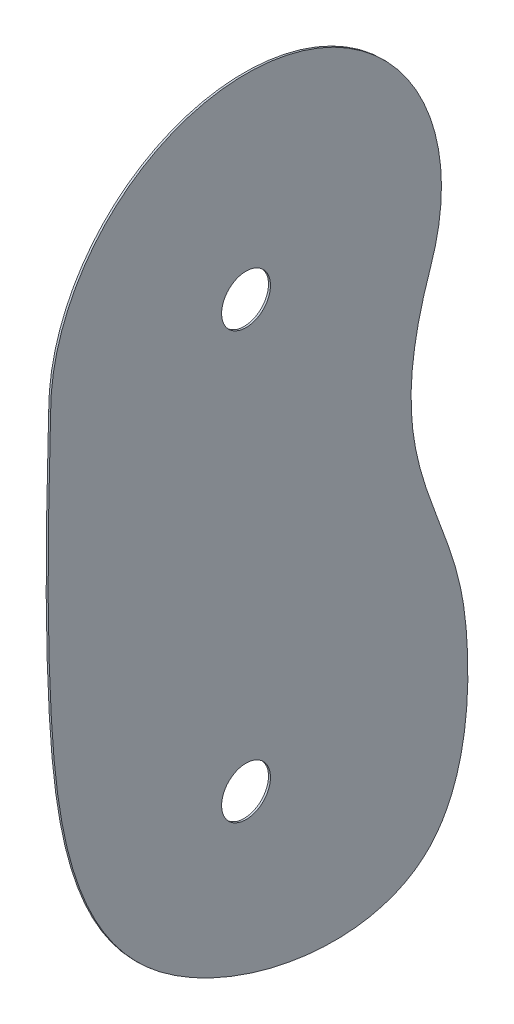
ISO-10303-21;
HEADER;
FILE_DESCRIPTION(('STEP AP214'),'2;1');
FILE_NAME('part.step','',(''),(''),'','','');
FILE_SCHEMA(('AUTOMOTIVE_DESIGN { 1 0 10303 214 1 1 1 1 }'));
ENDSEC;
DATA;
#1=APPLICATION_CONTEXT('core data for automotive mechanical design processes');
#2=APPLICATION_PROTOCOL_DEFINITION('international standard','automotive_design',2000,#1);
#3=PRODUCT_CONTEXT('',#1,'mechanical');
#4=PRODUCT('Part','Part','',(#3));
#5=PRODUCT_RELATED_PRODUCT_CATEGORY('part','',(#4));
#6=PRODUCT_DEFINITION_FORMATION('','',#4);
#7=PRODUCT_DEFINITION_CONTEXT('part definition',#1,'design');
#8=PRODUCT_DEFINITION('design','',#6,#7);
#9=PRODUCT_DEFINITION_SHAPE('','',#8);
#10=(LENGTH_UNIT() NAMED_UNIT(*) SI_UNIT(.MILLI.,.METRE.));
#11=(NAMED_UNIT(*) PLANE_ANGLE_UNIT() SI_UNIT($,.RADIAN.));
#12=(NAMED_UNIT(*) SI_UNIT($,.STERADIAN.) SOLID_ANGLE_UNIT());
#13=UNCERTAINTY_MEASURE_WITH_UNIT(LENGTH_MEASURE(1.E-05),#10,'distance_accuracy_value','');
#14=(GEOMETRIC_REPRESENTATION_CONTEXT(3) GLOBAL_UNCERTAINTY_ASSIGNED_CONTEXT((#13)) GLOBAL_UNIT_ASSIGNED_CONTEXT((#10,
#11,#12)) REPRESENTATION_CONTEXT('',''));
#15=CARTESIAN_POINT('',(0.,0.,0.));
#16=DIRECTION('',(0.,0.,1.));
#17=DIRECTION('',(1.,0.,0.));
#18=AXIS2_PLACEMENT_3D('',#15,#16,#17);
#19=CARTESIAN_POINT('',(0.5,-81.5352411158289,-1.72071329324622));
#20=DIRECTION('',(-1.,0.,0.));
#21=DIRECTION('',(0.,0.,1.));
#22=AXIS2_PLACEMENT_3D('',#19,#20,#21);
#23=PLANE('',#22);
#24=CARTESIAN_POINT('',(0.5,218.04414446959,100.));
#25=CARTESIAN_POINT('',(0.5,176.102025700215,101.111913872088));
#26=CARTESIAN_POINT('',(0.5,85.3151683348091,103.518734725915));
#27=CARTESIAN_POINT('',(0.5,-71.5417438617256,83.8198638376779));
#28=CARTESIAN_POINT('',(0.5,-110.410209260752,-100.905342663381));
#29=CARTESIAN_POINT('',(0.5,-17.8678230538649,-116.073780252456));
#30=CARTESIAN_POINT('',(0.5,75.9667877246872,-107.055453984839));
#31=CARTESIAN_POINT('',(0.5,109.221084996341,-68.1048943007391));
#32=CARTESIAN_POINT('',(0.5,185.280697489311,-94.480455873003));
#33=B_SPLINE_CURVE_WITH_KNOTS('',3,(#24,#25,#26,#27,#28,#29,#30,#31,#32),.UNSPECIFIED.,.F.,.F.,
(4,1,1,1,1,1,4),(0.,0.197079697906636,0.426593766563161,0.635543354266161,0.759464338141734,
0.795910002715118,1.),.UNSPECIFIED.);
#34=CARTESIAN_POINT('',(0.5,218.04414446959,100.));
#35=VERTEX_POINT('',#34);
#36=CARTESIAN_POINT('',(0.5,185.280697489311,-94.480455873003));
#37=VERTEX_POINT('',#36);
#38=EDGE_CURVE('E66',#35,#37,#33,.T.);
#39=ORIENTED_EDGE('',*,*,#38,.T.);
#40=CARTESIAN_POINT('',(0.5,218.04414446959,0.));
#41=DIRECTION('',(1.,0.,0.));
#42=DIRECTION('',(0.,0.,-1.));
#43=AXIS2_PLACEMENT_3D('',#40,#41,#42);
#44=CIRCLE('',#43,100.);
#45=EDGE_CURVE('E51',#37,#35,#44,.T.);
#46=ORIENTED_EDGE('',*,*,#45,.T.);
#47=EDGE_LOOP('',(#39,#46));
#48=FACE_BOUND('',#47,.T.);
#49=CARTESIAN_POINT('',(0.5,218.04414446959,0.));
#50=DIRECTION('',(1.,0.,0.));
#51=DIRECTION('',(0.,0.,-1.));
#52=AXIS2_PLACEMENT_3D('',#49,#50,#51);
#53=CIRCLE('',#52,12.5);
#54=CARTESIAN_POINT('',(0.5,218.04414446959,-12.5));
#55=VERTEX_POINT('',#54);
#56=EDGE_CURVE('E72',#55,#55,#53,.T.);
#57=ORIENTED_EDGE('',*,*,#56,.F.);
#58=EDGE_LOOP('',(#57));
#59=FACE_BOUND('',#58,.T.);
#60=CARTESIAN_POINT('',(0.5,0.,0.));
#61=DIRECTION('',(1.,0.,0.));
#62=DIRECTION('',(0.,0.,-1.));
#63=AXIS2_PLACEMENT_3D('',#60,#61,#62);
#64=CIRCLE('',#63,12.5);
#65=CARTESIAN_POINT('',(0.5,0.,-12.5));
#66=VERTEX_POINT('',#65);
#67=EDGE_CURVE('E91',#66,#66,#64,.T.);
#68=ORIENTED_EDGE('',*,*,#67,.F.);
#69=EDGE_LOOP('',(#68));
#70=FACE_BOUND('',#69,.T.);
#71=ADVANCED_FACE('F34',(#48,#59,#70),#23,.F.);
#72=CARTESIAN_POINT('',(-0.5,-81.5352411158289,-1.72071329324622));
#73=DIRECTION('',(-1.,0.,0.));
#74=DIRECTION('',(0.,0.,1.));
#75=AXIS2_PLACEMENT_3D('',#72,#73,#74);
#76=PLANE('',#75);
#77=CARTESIAN_POINT('',(-0.5,218.04414446959,0.));
#78=DIRECTION('',(1.,0.,0.));
#79=DIRECTION('',(0.,0.,-1.));
#80=AXIS2_PLACEMENT_3D('',#77,#78,#79);
#81=CIRCLE('',#80,12.5);
#82=CARTESIAN_POINT('',(-0.5,218.04414446959,-12.5));
#83=VERTEX_POINT('',#82);
#84=EDGE_CURVE('E75',#83,#83,#81,.T.);
#85=ORIENTED_EDGE('',*,*,#84,.T.);
#86=EDGE_LOOP('',(#85));
#87=FACE_BOUND('',#86,.T.);
#88=CARTESIAN_POINT('',(-0.5,218.04414446959,100.));
#89=CARTESIAN_POINT('',(-0.5,176.102025700215,101.111913872088));
#90=CARTESIAN_POINT('',(-0.5,85.3151683348091,103.518734725915));
#91=CARTESIAN_POINT('',(-0.5,-71.5417438617256,83.8198638376779));
#92=CARTESIAN_POINT('',(-0.5,-110.410209260752,-100.905342663381));
#93=CARTESIAN_POINT('',(-0.5,-17.8678230538649,-116.073780252456));
#94=CARTESIAN_POINT('',(-0.5,75.9667877246872,-107.055453984839));
#95=CARTESIAN_POINT('',(-0.5,109.221084996341,-68.1048943007391));
#96=CARTESIAN_POINT('',(-0.5,185.280697489311,-94.480455873003));
#97=B_SPLINE_CURVE_WITH_KNOTS('',3,(#88,#89,#90,#91,#92,#93,#94,#95,#96),.UNSPECIFIED.,.F.,.F.,
(4,1,1,1,1,1,4),(0.,0.197079697906636,0.426593766563161,0.635543354266161,0.759464338141734,
0.795910002715118,1.),.UNSPECIFIED.);
#98=CARTESIAN_POINT('',(-0.5,218.04414446959,100.));
#99=VERTEX_POINT('',#98);
#100=CARTESIAN_POINT('',(-0.5,185.280697489311,-94.480455873003));
#101=VERTEX_POINT('',#100);
#102=EDGE_CURVE('E67',#99,#101,#97,.T.);
#103=ORIENTED_EDGE('',*,*,#102,.F.);
#104=CARTESIAN_POINT('',(-0.5,218.04414446959,0.));
#105=DIRECTION('',(1.,0.,0.));
#106=DIRECTION('',(0.,0.,-1.));
#107=AXIS2_PLACEMENT_3D('',#104,#105,#106);
#108=CIRCLE('',#107,100.);
#109=EDGE_CURVE('E59',#101,#99,#108,.T.);
#110=ORIENTED_EDGE('',*,*,#109,.F.);
#111=EDGE_LOOP('',(#103,#110));
#112=FACE_BOUND('',#111,.T.);
#113=CARTESIAN_POINT('',(-0.5,0.,0.));
#114=DIRECTION('',(1.,0.,0.));
#115=DIRECTION('',(0.,0.,-1.));
#116=AXIS2_PLACEMENT_3D('',#113,#114,#115);
#117=CIRCLE('',#116,12.5);
#118=CARTESIAN_POINT('',(-0.5,0.,-12.5));
#119=VERTEX_POINT('',#118);
#120=EDGE_CURVE('E93',#119,#119,#117,.T.);
#121=ORIENTED_EDGE('',*,*,#120,.T.);
#122=EDGE_LOOP('',(#121));
#123=FACE_BOUND('',#122,.T.);
#124=ADVANCED_FACE('F70',(#87,#112,#123),#76,.T.);
#125=DIRECTION('',(-1.,0.,0.));
#126=VECTOR('',#125,1.);
#127=SURFACE_OF_LINEAR_EXTRUSION('',#33,#126);
#128=ORIENTED_EDGE('',*,*,#102,.T.);
#129=DIRECTION('',(-1.,0.,0.));
#130=VECTOR('',#129,1.);
#131=CARTESIAN_POINT('',(0.5,185.280697489311,-94.480455873003));
#132=LINE('',#131,#130);
#133=EDGE_CURVE('E11',#37,#101,#132,.T.);
#134=ORIENTED_EDGE('',*,*,#133,.F.);
#135=ORIENTED_EDGE('',*,*,#38,.F.);
#136=DIRECTION('',(-1.,0.,0.));
#137=VECTOR('',#136,1.);
#138=CARTESIAN_POINT('',(0.5,218.04414446959,100.));
#139=LINE('',#138,#137);
#140=EDGE_CURVE('E44',#35,#99,#139,.T.);
#141=ORIENTED_EDGE('',*,*,#140,.T.);
#142=EDGE_LOOP('',(#128,#134,#135,#141));
#143=FACE_BOUND('',#142,.T.);
#144=ADVANCED_FACE('F36',(#143),#127,.F.);
#145=CARTESIAN_POINT('',(0.5,218.04414446959,0.));
#146=DIRECTION('',(-1.,0.,0.));
#147=DIRECTION('',(0.,0.,1.));
#148=AXIS2_PLACEMENT_3D('',#145,#146,#147);
#149=CYLINDRICAL_SURFACE('',#148,100.);
#150=ORIENTED_EDGE('',*,*,#109,.T.);
#151=ORIENTED_EDGE('',*,*,#140,.F.);
#152=ORIENTED_EDGE('',*,*,#45,.F.);
#153=ORIENTED_EDGE('',*,*,#133,.T.);
#154=EDGE_LOOP('',(#150,#151,#152,#153));
#155=FACE_BOUND('',#154,.T.);
#156=ADVANCED_FACE('F62',(#155),#149,.T.);
#157=CARTESIAN_POINT('',(0.5,218.04414446959,0.));
#158=DIRECTION('',(-1.,0.,0.));
#159=DIRECTION('',(0.,0.,1.));
#160=AXIS2_PLACEMENT_3D('',#157,#158,#159);
#161=CYLINDRICAL_SURFACE('',#160,12.5);
#162=ORIENTED_EDGE('',*,*,#56,.T.);
#163=EDGE_LOOP('',(#162));
#164=FACE_BOUND('',#163,.T.);
#165=ORIENTED_EDGE('',*,*,#84,.F.);
#166=EDGE_LOOP('',(#165));
#167=FACE_BOUND('',#166,.T.);
#168=ADVANCED_FACE('F111',(#164,#167),#161,.F.);
#169=CARTESIAN_POINT('',(0.5,0.,0.));
#170=DIRECTION('',(-1.,0.,0.));
#171=DIRECTION('',(0.,0.,1.));
#172=AXIS2_PLACEMENT_3D('',#169,#170,#171);
#173=CYLINDRICAL_SURFACE('',#172,12.5);
#174=ORIENTED_EDGE('',*,*,#67,.T.);
#175=EDGE_LOOP('',(#174));
#176=FACE_BOUND('',#175,.T.);
#177=ORIENTED_EDGE('',*,*,#120,.F.);
#178=EDGE_LOOP('',(#177));
#179=FACE_BOUND('',#178,.T.);
#180=ADVANCED_FACE('F99',(#176,#179),#173,.F.);
#181=CLOSED_SHELL('',(#71,#124,#144,#156,#168,#180));
#182=MANIFOLD_SOLID_BREP('B2',#181);
#183=ADVANCED_BREP_SHAPE_REPRESENTATION('',(#18,#182),#14);
#184=SHAPE_DEFINITION_REPRESENTATION(#9,#183);
ENDSEC;
END-ISO-10303-21;
